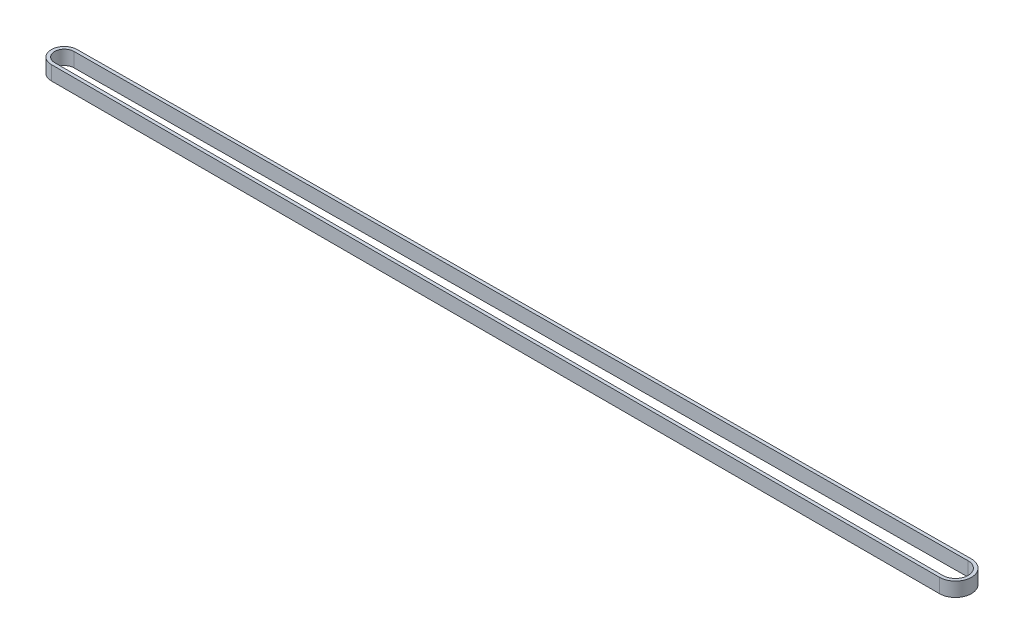
ISO-10303-21;
HEADER;
FILE_DESCRIPTION(('STEP AP214'),'2;1');
FILE_NAME('part.step','',(''),(''),'','','');
FILE_SCHEMA(('AUTOMOTIVE_DESIGN { 1 0 10303 214 1 1 1 1 }'));
ENDSEC;
DATA;
#1=APPLICATION_CONTEXT('core data for automotive mechanical design processes');
#2=APPLICATION_PROTOCOL_DEFINITION('international standard','automotive_design',2000,#1);
#3=PRODUCT_CONTEXT('',#1,'mechanical');
#4=PRODUCT('Part','Part','',(#3));
#5=PRODUCT_RELATED_PRODUCT_CATEGORY('part','',(#4));
#6=PRODUCT_DEFINITION_FORMATION('','',#4);
#7=PRODUCT_DEFINITION_CONTEXT('part definition',#1,'design');
#8=PRODUCT_DEFINITION('design','',#6,#7);
#9=PRODUCT_DEFINITION_SHAPE('','',#8);
#10=(LENGTH_UNIT() NAMED_UNIT(*) SI_UNIT(.MILLI.,.METRE.));
#11=(NAMED_UNIT(*) PLANE_ANGLE_UNIT() SI_UNIT($,.RADIAN.));
#12=(NAMED_UNIT(*) SI_UNIT($,.STERADIAN.) SOLID_ANGLE_UNIT());
#13=UNCERTAINTY_MEASURE_WITH_UNIT(LENGTH_MEASURE(1.E-05),#10,'distance_accuracy_value','');
#14=(GEOMETRIC_REPRESENTATION_CONTEXT(3) GLOBAL_UNCERTAINTY_ASSIGNED_CONTEXT((#13)) GLOBAL_UNIT_ASSIGNED_CONTEXT((#10,
#11,#12)) REPRESENTATION_CONTEXT('',''));
#15=CARTESIAN_POINT('',(0.,0.,0.));
#16=DIRECTION('',(0.,0.,1.));
#17=DIRECTION('',(1.,0.,0.));
#18=AXIS2_PLACEMENT_3D('',#15,#16,#17);
#19=CARTESIAN_POINT('',(-30.0120480046425,18.5000000000001,-32.3698745365316));
#20=DIRECTION('',(-0.00677415884786135,0.,-0.999977055122718));
#21=DIRECTION('',(-0.999977055122718,0.,0.00677415884786135));
#22=AXIS2_PLACEMENT_3D('',#19,#20,#21);
#23=PLANE('',#22);
#24=DIRECTION('',(0.999977055122718,0.,-0.00677415884786126));
#25=VECTOR('',#24,1.);
#26=CARTESIAN_POINT('',(-30.0120480046425,12.5,-32.3698745365316));
#27=LINE('',#26,#25);
#28=CARTESIAN_POINT('',(-30.0120513267701,12.5000000000001,-32.3698745140244));
#29=VERTEX_POINT('',#28);
#30=CARTESIAN_POINT('',(344.929342169365,12.5000000000002,-34.9098453515269));
#31=VERTEX_POINT('',#30);
#32=EDGE_CURVE('E130',#29,#31,#27,.T.);
#33=ORIENTED_EDGE('',*,*,#32,.F.);
#34=DIRECTION('',(0.,-1.,0.));
#35=VECTOR('',#34,1.);
#36=CARTESIAN_POINT('',(-30.0120480046425,18.5000000000001,-32.3698745365275));
#37=LINE('',#36,#35);
#38=CARTESIAN_POINT('',(-30.0120513267701,18.5000000000001,-32.3698745140244));
#39=VERTEX_POINT('',#38);
#40=EDGE_CURVE('E94',#39,#29,#37,.T.);
#41=ORIENTED_EDGE('',*,*,#40,.F.);
#42=DIRECTION('',(0.999977055122718,0.,-0.00677415884786126));
#43=VECTOR('',#42,1.);
#44=CARTESIAN_POINT('',(-30.0120480046425,18.5,-32.3698745365316));
#45=LINE('',#44,#43);
#46=CARTESIAN_POINT('',(344.929342169365,18.5000000000002,-34.9098453515269));
#47=VERTEX_POINT('',#46);
#48=EDGE_CURVE('E101',#39,#47,#45,.T.);
#49=ORIENTED_EDGE('',*,*,#48,.T.);
#50=DIRECTION('',(0.,-1.,0.));
#51=VECTOR('',#50,1.);
#52=CARTESIAN_POINT('',(344.929342169365,18.5000000000002,-34.9098453515269));
#53=LINE('',#52,#51);
#54=EDGE_CURVE('E76',#31,#47,#53,.F.);
#55=ORIENTED_EDGE('',*,*,#54,.F.);
#56=EDGE_LOOP('',(#33,#41,#49,#55));
#57=FACE_BOUND('',#56,.T.);
#58=ADVANCED_FACE('F17',(#57),#23,.T.);
#59=CARTESIAN_POINT('',(344.975,18.5000000000002,-28.1699999999998));
#60=DIRECTION('',(0.,-1.,0.));
#61=DIRECTION('',(1.,0.,0.));
#62=AXIS2_PLACEMENT_3D('',#59,#60,#61);
#63=CYLINDRICAL_SURFACE('',#62,6.73999999999999);
#64=CARTESIAN_POINT('',(344.975,12.5000000000002,-28.1699999999998));
#65=DIRECTION('',(0.,-1.,0.));
#66=DIRECTION('',(1.,0.,0.));
#67=AXIS2_PLACEMENT_3D('',#64,#65,#66);
#68=CIRCLE('',#67,6.73999999999999);
#69=CARTESIAN_POINT('',(344.975,12.5000000000002,-21.4299999999998));
#70=VERTEX_POINT('',#69);
#71=EDGE_CURVE('E128',#31,#70,#68,.T.);
#72=ORIENTED_EDGE('',*,*,#71,.F.);
#73=ORIENTED_EDGE('',*,*,#54,.T.);
#74=CARTESIAN_POINT('',(344.975,18.5000000000002,-28.1699999999998));
#75=DIRECTION('',(0.,-1.,0.));
#76=DIRECTION('',(1.,0.,0.));
#77=AXIS2_PLACEMENT_3D('',#74,#75,#76);
#78=CIRCLE('',#77,6.73999999999999);
#79=CARTESIAN_POINT('',(344.975,18.5000000000002,-21.4299999999998));
#80=VERTEX_POINT('',#79);
#81=EDGE_CURVE('E20',#47,#80,#78,.T.);
#82=ORIENTED_EDGE('',*,*,#81,.T.);
#83=DIRECTION('',(0.,1.,0.));
#84=VECTOR('',#83,1.);
#85=CARTESIAN_POINT('',(344.975,18.5000000000002,-21.4299999999998));
#86=LINE('',#85,#84);
#87=EDGE_CURVE('E81',#70,#80,#86,.T.);
#88=ORIENTED_EDGE('',*,*,#87,.F.);
#89=EDGE_LOOP('',(#72,#73,#82,#88));
#90=FACE_BOUND('',#89,.T.);
#91=ADVANCED_FACE('F80',(#90),#63,.T.);
#92=CARTESIAN_POINT('',(344.975,18.5000000000002,-21.4299999999998));
#93=DIRECTION('',(0.,0.,1.));
#94=DIRECTION('',(1.,0.,0.));
#95=AXIS2_PLACEMENT_3D('',#92,#93,#94);
#96=PLANE('',#95);
#97=DIRECTION('',(1.,0.,0.));
#98=VECTOR('',#97,1.);
#99=CARTESIAN_POINT('',(158.135,12.5000000000001,-21.4299999999998));
#100=LINE('',#99,#98);
#101=CARTESIAN_POINT('',(-29.975,12.5000000000001,-21.4299999999999));
#102=VERTEX_POINT('',#101);
#103=EDGE_CURVE('E92',#70,#102,#100,.F.);
#104=ORIENTED_EDGE('',*,*,#103,.F.);
#105=ORIENTED_EDGE('',*,*,#87,.T.);
#106=DIRECTION('',(1.,0.,0.));
#107=VECTOR('',#106,1.);
#108=CARTESIAN_POINT('',(158.135,18.5000000000001,-21.4299999999998));
#109=LINE('',#108,#107);
#110=CARTESIAN_POINT('',(-29.975,18.5000000000001,-21.4299999999999));
#111=VERTEX_POINT('',#110);
#112=EDGE_CURVE('E86',#80,#111,#109,.F.);
#113=ORIENTED_EDGE('',*,*,#112,.T.);
#114=DIRECTION('',(0.,-1.,0.));
#115=VECTOR('',#114,1.);
#116=CARTESIAN_POINT('',(-29.975,18.5000000000001,-21.43));
#117=LINE('',#116,#115);
#118=EDGE_CURVE('E87',#102,#111,#117,.F.);
#119=ORIENTED_EDGE('',*,*,#118,.F.);
#120=EDGE_LOOP('',(#104,#105,#113,#119));
#121=FACE_BOUND('',#120,.T.);
#122=ADVANCED_FACE('F89',(#121),#96,.T.);
#123=CARTESIAN_POINT('',(-29.975,18.5000000000001,-26.9));
#124=DIRECTION('',(0.,-1.,0.));
#125=DIRECTION('',(1.,0.,0.));
#126=AXIS2_PLACEMENT_3D('',#123,#124,#125);
#127=CYLINDRICAL_SURFACE('',#126,5.47);
#128=CARTESIAN_POINT('',(-29.975,12.5000000000001,-26.9));
#129=DIRECTION('',(0.,-1.,0.));
#130=DIRECTION('',(1.,0.,0.));
#131=AXIS2_PLACEMENT_3D('',#128,#129,#130);
#132=CIRCLE('',#131,5.47);
#133=EDGE_CURVE('E125',#102,#29,#132,.T.);
#134=ORIENTED_EDGE('',*,*,#133,.F.);
#135=ORIENTED_EDGE('',*,*,#118,.T.);
#136=CARTESIAN_POINT('',(-29.975,18.5000000000001,-26.9));
#137=DIRECTION('',(0.,-1.,0.));
#138=DIRECTION('',(1.,0.,0.));
#139=AXIS2_PLACEMENT_3D('',#136,#137,#138);
#140=CIRCLE('',#139,5.47);
#141=EDGE_CURVE('E99',#111,#39,#140,.T.);
#142=ORIENTED_EDGE('',*,*,#141,.T.);
#143=ORIENTED_EDGE('',*,*,#40,.T.);
#144=EDGE_LOOP('',(#134,#135,#142,#143));
#145=FACE_BOUND('',#144,.T.);
#146=ADVANCED_FACE('F153',(#145),#127,.T.);
#147=CARTESIAN_POINT('',(-29.975,18.5000000000001,-22.8099999999998));
#148=DIRECTION('',(0.,0.,-1.));
#149=DIRECTION('',(-1.,0.,0.));
#150=AXIS2_PLACEMENT_3D('',#147,#148,#149);
#151=PLANE('',#150);
#152=DIRECTION('',(1.,0.,0.));
#153=VECTOR('',#152,1.);
#154=CARTESIAN_POINT('',(158.135,12.5000000000001,-22.8099999999998));
#155=LINE('',#154,#153);
#156=CARTESIAN_POINT('',(-29.975,12.5000000000001,-22.8099999999999));
#157=VERTEX_POINT('',#156);
#158=CARTESIAN_POINT('',(344.975,12.5000000000002,-22.8099999999998));
#159=VERTEX_POINT('',#158);
#160=EDGE_CURVE('E108',#157,#159,#155,.T.);
#161=ORIENTED_EDGE('',*,*,#160,.F.);
#162=DIRECTION('',(0.,-1.,0.));
#163=VECTOR('',#162,1.);
#164=CARTESIAN_POINT('',(-29.975,18.5000000000001,-22.81));
#165=LINE('',#164,#163);
#166=CARTESIAN_POINT('',(-29.975,18.5000000000001,-22.8099999999999));
#167=VERTEX_POINT('',#166);
#168=EDGE_CURVE('E109',#157,#167,#165,.F.);
#169=ORIENTED_EDGE('',*,*,#168,.T.);
#170=DIRECTION('',(1.,0.,0.));
#171=VECTOR('',#170,1.);
#172=CARTESIAN_POINT('',(158.135,18.5000000000001,-22.8099999999998));
#173=LINE('',#172,#171);
#174=CARTESIAN_POINT('',(344.975,18.5000000000002,-22.8099999999998));
#175=VERTEX_POINT('',#174);
#176=EDGE_CURVE('E112',#167,#175,#173,.T.);
#177=ORIENTED_EDGE('',*,*,#176,.T.);
#178=DIRECTION('',(0.,-1.,0.));
#179=VECTOR('',#178,1.);
#180=CARTESIAN_POINT('',(344.975,18.5000000000002,-22.8099999999998));
#181=LINE('',#180,#179);
#182=EDGE_CURVE('E105',#175,#159,#181,.T.);
#183=ORIENTED_EDGE('',*,*,#182,.T.);
#184=EDGE_LOOP('',(#161,#169,#177,#183));
#185=FACE_BOUND('',#184,.T.);
#186=ADVANCED_FACE('F175',(#185),#151,.T.);
#187=CARTESIAN_POINT('',(158.135,18.5000000000001,-28.1699999999998));
#188=DIRECTION('',(0.,-1.,0.));
#189=DIRECTION('',(1.,0.,0.));
#190=AXIS2_PLACEMENT_3D('',#187,#188,#189);
#191=PLANE('',#190);
#192=DIRECTION('',(0.999977055122718,0.,-0.00677415884786141));
#193=VECTOR('',#192,1.);
#194=CARTESIAN_POINT('',(344.938690508576,18.5000000000002,-33.5298770154576));
#195=LINE('',#194,#193);
#196=CARTESIAN_POINT('',(344.938690508576,18.5000000000002,-33.5298770154576));
#197=VERTEX_POINT('',#196);
#198=CARTESIAN_POINT('',(-30.0027063096878,18.5000000000001,-30.989906155452));
#199=VERTEX_POINT('',#198);
#200=EDGE_CURVE('E120',#197,#199,#195,.F.);
#201=ORIENTED_EDGE('',*,*,#200,.F.);
#202=CARTESIAN_POINT('',(344.975,18.5000000000002,-28.1699999999998));
#203=DIRECTION('',(0.,-1.,0.));
#204=DIRECTION('',(1.,0.,0.));
#205=AXIS2_PLACEMENT_3D('',#202,#203,#204);
#206=CIRCLE('',#205,5.36000000000001);
#207=EDGE_CURVE('E117',#197,#175,#206,.T.);
#208=ORIENTED_EDGE('',*,*,#207,.T.);
#209=ORIENTED_EDGE('',*,*,#176,.F.);
#210=CARTESIAN_POINT('',(-29.975,18.5000000000001,-26.9));
#211=DIRECTION('',(0.,-1.,0.));
#212=DIRECTION('',(1.,0.,0.));
#213=AXIS2_PLACEMENT_3D('',#210,#211,#212);
#214=CIRCLE('',#213,4.09);
#215=EDGE_CURVE('E111',#167,#199,#214,.T.);
#216=ORIENTED_EDGE('',*,*,#215,.T.);
#217=EDGE_LOOP('',(#201,#208,#209,#216));
#218=FACE_BOUND('',#217,.T.);
#219=ORIENTED_EDGE('',*,*,#141,.F.);
#220=ORIENTED_EDGE('',*,*,#112,.F.);
#221=ORIENTED_EDGE('',*,*,#81,.F.);
#222=ORIENTED_EDGE('',*,*,#48,.F.);
#223=EDGE_LOOP('',(#219,#220,#221,#222));
#224=FACE_BOUND('',#223,.T.);
#225=ADVANCED_FACE('F97',(#218,#224),#191,.F.);
#226=CARTESIAN_POINT('',(-29.975,18.5000000000001,-26.9));
#227=DIRECTION('',(0.,-1.,0.));
#228=DIRECTION('',(1.,0.,0.));
#229=AXIS2_PLACEMENT_3D('',#226,#227,#228);
#230=CYLINDRICAL_SURFACE('',#229,4.09);
#231=ORIENTED_EDGE('',*,*,#168,.F.);
#232=CARTESIAN_POINT('',(-29.975,12.5000000000001,-26.9));
#233=DIRECTION('',(0.,-1.,0.));
#234=DIRECTION('',(1.,0.,0.));
#235=AXIS2_PLACEMENT_3D('',#232,#233,#234);
#236=CIRCLE('',#235,4.09);
#237=CARTESIAN_POINT('',(-30.0027063096878,12.5000000000001,-30.989906155452));
#238=VERTEX_POINT('',#237);
#239=EDGE_CURVE('E122',#238,#157,#236,.F.);
#240=ORIENTED_EDGE('',*,*,#239,.F.);
#241=DIRECTION('',(0.,1.,0.));
#242=VECTOR('',#241,1.);
#243=CARTESIAN_POINT('',(-30.0027063096878,18.5000000000002,-30.989906155452));
#244=LINE('',#243,#242);
#245=EDGE_CURVE('E142',#199,#238,#244,.F.);
#246=ORIENTED_EDGE('',*,*,#245,.F.);
#247=ORIENTED_EDGE('',*,*,#215,.F.);
#248=EDGE_LOOP('',(#231,#240,#246,#247));
#249=FACE_BOUND('',#248,.T.);
#250=ADVANCED_FACE('F157',(#249),#230,.F.);
#251=CARTESIAN_POINT('',(158.135,12.5000000000001,-28.1699999999998));
#252=DIRECTION('',(0.,-1.,0.));
#253=DIRECTION('',(1.,0.,0.));
#254=AXIS2_PLACEMENT_3D('',#251,#252,#253);
#255=PLANE('',#254);
#256=CARTESIAN_POINT('',(344.975,12.5000000000002,-28.1699999999998));
#257=DIRECTION('',(0.,-1.,0.));
#258=DIRECTION('',(1.,0.,0.));
#259=AXIS2_PLACEMENT_3D('',#256,#257,#258);
#260=CIRCLE('',#259,5.36000000000001);
#261=CARTESIAN_POINT('',(344.938690508576,12.5000000000001,-33.5298770154576));
#262=VERTEX_POINT('',#261);
#263=EDGE_CURVE('E35',#159,#262,#260,.F.);
#264=ORIENTED_EDGE('',*,*,#263,.T.);
#265=DIRECTION('',(0.999977055122718,0.,-0.00677415884786141));
#266=VECTOR('',#265,1.);
#267=CARTESIAN_POINT('',(344.938690508576,12.5000000000001,-33.5298770154576));
#268=LINE('',#267,#266);
#269=EDGE_CURVE('E26',#238,#262,#268,.T.);
#270=ORIENTED_EDGE('',*,*,#269,.F.);
#271=ORIENTED_EDGE('',*,*,#239,.T.);
#272=ORIENTED_EDGE('',*,*,#160,.T.);
#273=EDGE_LOOP('',(#264,#270,#271,#272));
#274=FACE_BOUND('',#273,.T.);
#275=ORIENTED_EDGE('',*,*,#103,.T.);
#276=ORIENTED_EDGE('',*,*,#133,.T.);
#277=ORIENTED_EDGE('',*,*,#32,.T.);
#278=ORIENTED_EDGE('',*,*,#71,.T.);
#279=EDGE_LOOP('',(#275,#276,#277,#278));
#280=FACE_BOUND('',#279,.T.);
#281=ADVANCED_FACE('F154',(#274,#280),#255,.T.);
#282=CARTESIAN_POINT('',(344.975,18.5000000000002,-28.1699999999998));
#283=DIRECTION('',(0.,-1.,0.));
#284=DIRECTION('',(1.,0.,0.));
#285=AXIS2_PLACEMENT_3D('',#282,#283,#284);
#286=CYLINDRICAL_SURFACE('',#285,5.36000000000001);
#287=DIRECTION('',(0.,1.,0.));
#288=VECTOR('',#287,1.);
#289=CARTESIAN_POINT('',(344.938690508576,18.5000000000002,-33.5298770154576));
#290=LINE('',#289,#288);
#291=EDGE_CURVE('E11',#262,#197,#290,.T.);
#292=ORIENTED_EDGE('',*,*,#291,.F.);
#293=ORIENTED_EDGE('',*,*,#263,.F.);
#294=ORIENTED_EDGE('',*,*,#182,.F.);
#295=ORIENTED_EDGE('',*,*,#207,.F.);
#296=EDGE_LOOP('',(#292,#293,#294,#295));
#297=FACE_BOUND('',#296,.T.);
#298=ADVANCED_FACE('F156',(#297),#286,.F.);
#299=CARTESIAN_POINT('',(344.938690508576,18.5000000000002,-33.5298770154576));
#300=DIRECTION('',(0.00677415884786141,0.,0.999977055122718));
#301=DIRECTION('',(0.999977055122718,0.,-0.00677415884786141));
#302=AXIS2_PLACEMENT_3D('',#299,#300,#301);
#303=PLANE('',#302);
#304=ORIENTED_EDGE('',*,*,#269,.T.);
#305=ORIENTED_EDGE('',*,*,#291,.T.);
#306=ORIENTED_EDGE('',*,*,#200,.T.);
#307=ORIENTED_EDGE('',*,*,#245,.T.);
#308=EDGE_LOOP('',(#304,#305,#306,#307));
#309=FACE_BOUND('',#308,.T.);
#310=ADVANCED_FACE('F164',(#309),#303,.T.);
#311=CLOSED_SHELL('',(#58,#91,#122,#146,#186,#225,#250,#281,#298,#310));
#312=MANIFOLD_SOLID_BREP('B1',#311);
#313=ADVANCED_BREP_SHAPE_REPRESENTATION('',(#18,#312),#14);
#314=SHAPE_DEFINITION_REPRESENTATION(#9,#313);
ENDSEC;
END-ISO-10303-21;
